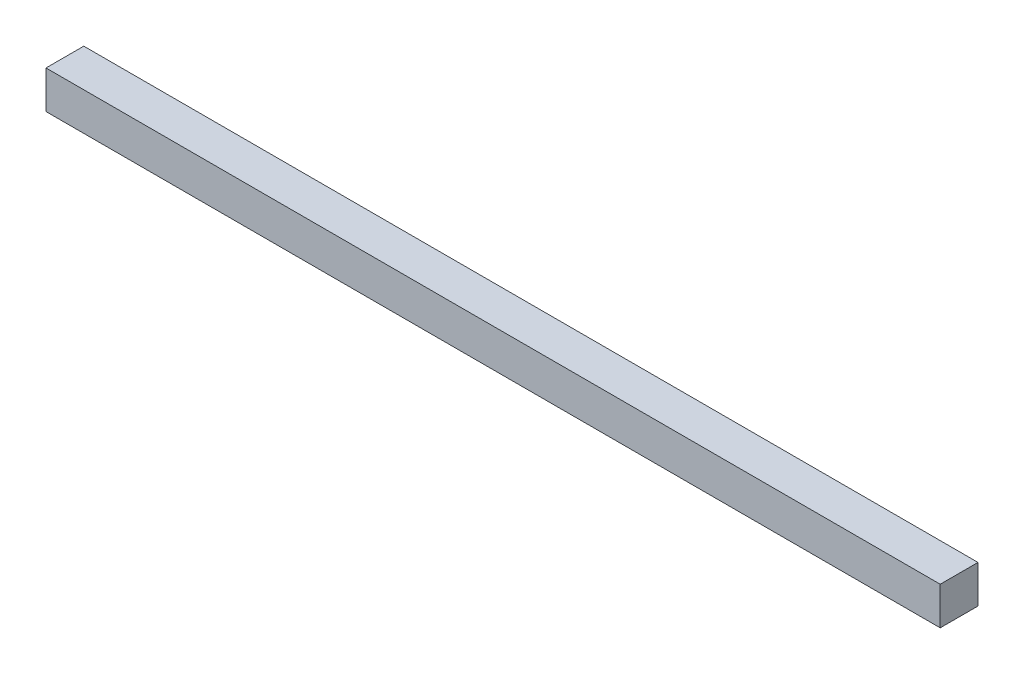
ISO-10303-21;
HEADER;
FILE_DESCRIPTION(('STEP AP214'),'2;1');
FILE_NAME('part.step','',(''),(''),'','','');
FILE_SCHEMA(('AUTOMOTIVE_DESIGN { 1 0 10303 214 1 1 1 1 }'));
ENDSEC;
DATA;
#1=APPLICATION_CONTEXT('core data for automotive mechanical design processes');
#2=APPLICATION_PROTOCOL_DEFINITION('international standard','automotive_design',2000,#1);
#3=PRODUCT_CONTEXT('',#1,'mechanical');
#4=PRODUCT('Part','Part','',(#3));
#5=PRODUCT_RELATED_PRODUCT_CATEGORY('part','',(#4));
#6=PRODUCT_DEFINITION_FORMATION('','',#4);
#7=PRODUCT_DEFINITION_CONTEXT('part definition',#1,'design');
#8=PRODUCT_DEFINITION('design','',#6,#7);
#9=PRODUCT_DEFINITION_SHAPE('','',#8);
#10=(LENGTH_UNIT() NAMED_UNIT(*) SI_UNIT(.MILLI.,.METRE.));
#11=(NAMED_UNIT(*) PLANE_ANGLE_UNIT() SI_UNIT($,.RADIAN.));
#12=(NAMED_UNIT(*) SI_UNIT($,.STERADIAN.) SOLID_ANGLE_UNIT());
#13=UNCERTAINTY_MEASURE_WITH_UNIT(LENGTH_MEASURE(1.E-05),#10,'distance_accuracy_value','');
#14=(GEOMETRIC_REPRESENTATION_CONTEXT(3) GLOBAL_UNCERTAINTY_ASSIGNED_CONTEXT((#13)) GLOBAL_UNIT_ASSIGNED_CONTEXT((#10,
#11,#12)) REPRESENTATION_CONTEXT('',''));
#15=CARTESIAN_POINT('',(0.,0.,0.));
#16=DIRECTION('',(0.,0.,1.));
#17=DIRECTION('',(1.,0.,0.));
#18=AXIS2_PLACEMENT_3D('',#15,#16,#17);
#19=CARTESIAN_POINT('',(0.,30.,0.));
#20=DIRECTION('',(1.,0.,0.));
#21=DIRECTION('',(0.,0.,-1.));
#22=AXIS2_PLACEMENT_3D('',#19,#20,#21);
#23=PLANE('',#22);
#24=DIRECTION('',(0.,0.,1.));
#25=VECTOR('',#24,1.);
#26=CARTESIAN_POINT('',(0.,0.,0.));
#27=LINE('',#26,#25);
#28=CARTESIAN_POINT('',(0.,0.,-30.));
#29=VERTEX_POINT('',#28);
#30=CARTESIAN_POINT('',(0.,0.,0.));
#31=VERTEX_POINT('',#30);
#32=EDGE_CURVE('E96',#29,#31,#27,.T.);
#33=ORIENTED_EDGE('',*,*,#32,.T.);
#34=DIRECTION('',(0.,-1.,0.));
#35=VECTOR('',#34,1.);
#36=CARTESIAN_POINT('',(0.,30.,0.));
#37=LINE('',#36,#35);
#38=CARTESIAN_POINT('',(0.,30.,0.));
#39=VERTEX_POINT('',#38);
#40=EDGE_CURVE('E11',#39,#31,#37,.T.);
#41=ORIENTED_EDGE('',*,*,#40,.F.);
#42=DIRECTION('',(0.,0.,1.));
#43=VECTOR('',#42,1.);
#44=CARTESIAN_POINT('',(0.,30.,0.));
#45=LINE('',#44,#43);
#46=CARTESIAN_POINT('',(0.,30.,-30.));
#47=VERTEX_POINT('',#46);
#48=EDGE_CURVE('E84',#47,#39,#45,.T.);
#49=ORIENTED_EDGE('',*,*,#48,.F.);
#50=DIRECTION('',(0.,-1.,0.));
#51=VECTOR('',#50,1.);
#52=CARTESIAN_POINT('',(0.,30.,-30.));
#53=LINE('',#52,#51);
#54=EDGE_CURVE('E92',#47,#29,#53,.T.);
#55=ORIENTED_EDGE('',*,*,#54,.T.);
#56=EDGE_LOOP('',(#33,#41,#49,#55));
#57=FACE_BOUND('',#56,.T.);
#58=ADVANCED_FACE('F33',(#57),#23,.F.);
#59=CARTESIAN_POINT('',(0.,30.,0.));
#60=DIRECTION('',(0.,0.,-1.));
#61=DIRECTION('',(-1.,0.,0.));
#62=AXIS2_PLACEMENT_3D('',#59,#60,#61);
#63=PLANE('',#62);
#64=DIRECTION('',(1.,0.,0.));
#65=VECTOR('',#64,1.);
#66=CARTESIAN_POINT('',(0.,0.,0.));
#67=LINE('',#66,#65);
#68=CARTESIAN_POINT('',(710.,0.,0.));
#69=VERTEX_POINT('',#68);
#70=EDGE_CURVE('E88',#31,#69,#67,.T.);
#71=ORIENTED_EDGE('',*,*,#70,.T.);
#72=DIRECTION('',(0.,-1.,0.));
#73=VECTOR('',#72,1.);
#74=CARTESIAN_POINT('',(710.,30.,0.));
#75=LINE('',#74,#73);
#76=CARTESIAN_POINT('',(710.,30.,0.));
#77=VERTEX_POINT('',#76);
#78=EDGE_CURVE('E41',#77,#69,#75,.T.);
#79=ORIENTED_EDGE('',*,*,#78,.F.);
#80=DIRECTION('',(1.,0.,0.));
#81=VECTOR('',#80,1.);
#82=CARTESIAN_POINT('',(0.,30.,0.));
#83=LINE('',#82,#81);
#84=EDGE_CURVE('E79',#39,#77,#83,.T.);
#85=ORIENTED_EDGE('',*,*,#84,.F.);
#86=ORIENTED_EDGE('',*,*,#40,.T.);
#87=EDGE_LOOP('',(#71,#79,#85,#86));
#88=FACE_BOUND('',#87,.T.);
#89=ADVANCED_FACE('F87',(#88),#63,.F.);
#90=CARTESIAN_POINT('',(710.,30.,0.));
#91=DIRECTION('',(-1.,0.,0.));
#92=DIRECTION('',(0.,0.,1.));
#93=AXIS2_PLACEMENT_3D('',#90,#91,#92);
#94=PLANE('',#93);
#95=DIRECTION('',(0.,0.,-1.));
#96=VECTOR('',#95,1.);
#97=CARTESIAN_POINT('',(710.,0.,0.));
#98=LINE('',#97,#96);
#99=CARTESIAN_POINT('',(710.,0.,-30.));
#100=VERTEX_POINT('',#99);
#101=EDGE_CURVE('E66',#69,#100,#98,.T.);
#102=ORIENTED_EDGE('',*,*,#101,.T.);
#103=DIRECTION('',(0.,-1.,0.));
#104=VECTOR('',#103,1.);
#105=CARTESIAN_POINT('',(710.,30.,-30.));
#106=LINE('',#105,#104);
#107=CARTESIAN_POINT('',(710.,30.,-30.));
#108=VERTEX_POINT('',#107);
#109=EDGE_CURVE('E89',#108,#100,#106,.T.);
#110=ORIENTED_EDGE('',*,*,#109,.F.);
#111=DIRECTION('',(0.,0.,-1.));
#112=VECTOR('',#111,1.);
#113=CARTESIAN_POINT('',(710.,30.,0.));
#114=LINE('',#113,#112);
#115=EDGE_CURVE('E82',#77,#108,#114,.T.);
#116=ORIENTED_EDGE('',*,*,#115,.F.);
#117=ORIENTED_EDGE('',*,*,#78,.T.);
#118=EDGE_LOOP('',(#102,#110,#116,#117));
#119=FACE_BOUND('',#118,.T.);
#120=ADVANCED_FACE('F90',(#119),#94,.F.);
#121=CARTESIAN_POINT('',(0.,30.,-30.));
#122=DIRECTION('',(0.,0.,1.));
#123=DIRECTION('',(1.,0.,0.));
#124=AXIS2_PLACEMENT_3D('',#121,#122,#123);
#125=PLANE('',#124);
#126=DIRECTION('',(-1.,0.,0.));
#127=VECTOR('',#126,1.);
#128=CARTESIAN_POINT('',(0.,0.,-30.));
#129=LINE('',#128,#127);
#130=EDGE_CURVE('E72',#100,#29,#129,.T.);
#131=ORIENTED_EDGE('',*,*,#130,.T.);
#132=ORIENTED_EDGE('',*,*,#54,.F.);
#133=DIRECTION('',(-1.,0.,0.));
#134=VECTOR('',#133,1.);
#135=CARTESIAN_POINT('',(0.,30.,-30.));
#136=LINE('',#135,#134);
#137=EDGE_CURVE('E49',#108,#47,#136,.T.);
#138=ORIENTED_EDGE('',*,*,#137,.F.);
#139=ORIENTED_EDGE('',*,*,#109,.T.);
#140=EDGE_LOOP('',(#131,#132,#138,#139));
#141=FACE_BOUND('',#140,.T.);
#142=ADVANCED_FACE('F103',(#141),#125,.F.);
#143=CARTESIAN_POINT('',(0.,30.,0.));
#144=DIRECTION('',(0.,-1.,0.));
#145=DIRECTION('',(0.,0.,-1.));
#146=AXIS2_PLACEMENT_3D('',#143,#144,#145);
#147=PLANE('',#146);
#148=ORIENTED_EDGE('',*,*,#48,.T.);
#149=ORIENTED_EDGE('',*,*,#84,.T.);
#150=ORIENTED_EDGE('',*,*,#115,.T.);
#151=ORIENTED_EDGE('',*,*,#137,.T.);
#152=EDGE_LOOP('',(#148,#149,#150,#151));
#153=FACE_BOUND('',#152,.T.);
#154=ADVANCED_FACE('F80',(#153),#147,.F.);
#155=CARTESIAN_POINT('',(0.,0.,0.));
#156=DIRECTION('',(0.,-1.,0.));
#157=DIRECTION('',(0.,0.,-1.));
#158=AXIS2_PLACEMENT_3D('',#155,#156,#157);
#159=PLANE('',#158);
#160=ORIENTED_EDGE('',*,*,#32,.F.);
#161=ORIENTED_EDGE('',*,*,#130,.F.);
#162=ORIENTED_EDGE('',*,*,#101,.F.);
#163=ORIENTED_EDGE('',*,*,#70,.F.);
#164=EDGE_LOOP('',(#160,#161,#162,#163));
#165=FACE_BOUND('',#164,.T.);
#166=ADVANCED_FACE('F106',(#165),#159,.T.);
#167=CLOSED_SHELL('',(#58,#89,#120,#142,#154,#166));
#168=MANIFOLD_SOLID_BREP('B2',#167);
#169=ADVANCED_BREP_SHAPE_REPRESENTATION('',(#18,#168),#14);
#170=SHAPE_DEFINITION_REPRESENTATION(#9,#169);
ENDSEC;
END-ISO-10303-21;
